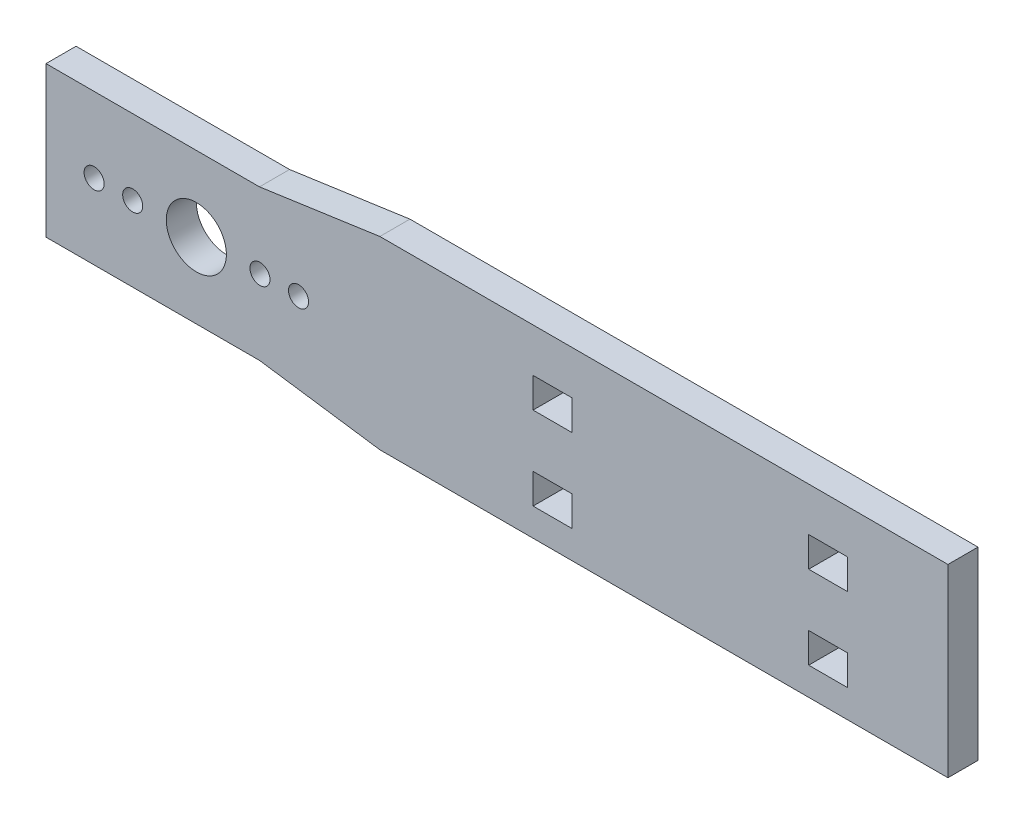
ISO-10303-21;
HEADER;
FILE_DESCRIPTION(('STEP AP214'),'2;1');
FILE_NAME('part.step','',(''),(''),'','','');
FILE_SCHEMA(('AUTOMOTIVE_DESIGN { 1 0 10303 214 1 1 1 1 }'));
ENDSEC;
DATA;
#1=APPLICATION_CONTEXT('core data for automotive mechanical design processes');
#2=APPLICATION_PROTOCOL_DEFINITION('international standard','automotive_design',2000,#1);
#3=PRODUCT_CONTEXT('',#1,'mechanical');
#4=PRODUCT('Part','Part','',(#3));
#5=PRODUCT_RELATED_PRODUCT_CATEGORY('part','',(#4));
#6=PRODUCT_DEFINITION_FORMATION('','',#4);
#7=PRODUCT_DEFINITION_CONTEXT('part definition',#1,'design');
#8=PRODUCT_DEFINITION('design','',#6,#7);
#9=PRODUCT_DEFINITION_SHAPE('','',#8);
#10=(LENGTH_UNIT() NAMED_UNIT(*) SI_UNIT(.MILLI.,.METRE.));
#11=(NAMED_UNIT(*) PLANE_ANGLE_UNIT() SI_UNIT($,.RADIAN.));
#12=(NAMED_UNIT(*) SI_UNIT($,.STERADIAN.) SOLID_ANGLE_UNIT());
#13=UNCERTAINTY_MEASURE_WITH_UNIT(LENGTH_MEASURE(1.E-05),#10,'distance_accuracy_value','');
#14=(GEOMETRIC_REPRESENTATION_CONTEXT(3) GLOBAL_UNCERTAINTY_ASSIGNED_CONTEXT((#13)) GLOBAL_UNIT_ASSIGNED_CONTEXT((#10,
#11,#12)) REPRESENTATION_CONTEXT('',''));
#15=CARTESIAN_POINT('',(0.,0.,0.));
#16=DIRECTION('',(0.,0.,1.));
#17=DIRECTION('',(1.,0.,0.));
#18=AXIS2_PLACEMENT_3D('',#15,#16,#17);
#19=CARTESIAN_POINT('',(0.,0.,3.));
#20=DIRECTION('',(0.,0.,1.));
#21=DIRECTION('',(1.,0.,0.));
#22=AXIS2_PLACEMENT_3D('',#19,#20,#21);
#23=PLANE('',#22);
#24=CARTESIAN_POINT('',(-394.38605443631,290.5765,3.));
#25=DIRECTION('',(0.,0.,1.));
#26=DIRECTION('',(1.,0.,0.));
#27=AXIS2_PLACEMENT_3D('',#24,#25,#26);
#28=CIRCLE('',#27,1.00090000000004);
#29=CARTESIAN_POINT('',(-393.38515443631,290.5765,3.));
#30=VERTEX_POINT('',#29);
#31=EDGE_CURVE('E496',#30,#30,#28,.T.);
#32=ORIENTED_EDGE('',*,*,#31,.F.);
#33=EDGE_LOOP('',(#32));
#34=FACE_BOUND('',#33,.T.);
#35=CARTESIAN_POINT('',(-398.23605443631,290.5765,3.));
#36=DIRECTION('',(0.,0.,1.));
#37=DIRECTION('',(1.,0.,0.));
#38=AXIS2_PLACEMENT_3D('',#35,#36,#37);
#39=CIRCLE('',#38,1.00090000000004);
#40=CARTESIAN_POINT('',(-397.23515443631,290.5765,3.));
#41=VERTEX_POINT('',#40);
#42=EDGE_CURVE('E490',#41,#41,#39,.T.);
#43=ORIENTED_EDGE('',*,*,#42,.F.);
#44=EDGE_LOOP('',(#43));
#45=FACE_BOUND('',#44,.T.);
#46=CARTESIAN_POINT('',(-410.93605443631,290.5765,3.));
#47=DIRECTION('',(0.,0.,1.));
#48=DIRECTION('',(1.,0.,0.));
#49=AXIS2_PLACEMENT_3D('',#46,#47,#48);
#50=CIRCLE('',#49,1.00090000000004);
#51=CARTESIAN_POINT('',(-409.93515443631,290.5765,3.));
#52=VERTEX_POINT('',#51);
#53=EDGE_CURVE('E484',#52,#52,#50,.T.);
#54=ORIENTED_EDGE('',*,*,#53,.F.);
#55=EDGE_LOOP('',(#54));
#56=FACE_BOUND('',#55,.T.);
#57=CARTESIAN_POINT('',(-414.78605443631,290.5765,3.));
#58=DIRECTION('',(0.,0.,1.));
#59=DIRECTION('',(1.,0.,0.));
#60=AXIS2_PLACEMENT_3D('',#57,#58,#59);
#61=CIRCLE('',#60,1.00090000000004);
#62=CARTESIAN_POINT('',(-413.78515443631,290.5765,3.));
#63=VERTEX_POINT('',#62);
#64=EDGE_CURVE('E478',#63,#63,#61,.T.);
#65=ORIENTED_EDGE('',*,*,#64,.F.);
#66=EDGE_LOOP('',(#65));
#67=FACE_BOUND('',#66,.T.);
#68=DIRECTION('',(1.,0.,0.));
#69=VECTOR('',#68,1.);
#70=CARTESIAN_POINT('',(-343.482562351102,284.140934884704,3.));
#71=LINE('',#70,#69);
#72=CARTESIAN_POINT('',(-343.482562351102,284.140934884704,3.));
#73=VERTEX_POINT('',#72);
#74=CARTESIAN_POINT('',(-339.602562351102,284.140934884704,3.));
#75=VERTEX_POINT('',#74);
#76=EDGE_CURVE('E202',#73,#75,#71,.T.);
#77=ORIENTED_EDGE('',*,*,#76,.F.);
#78=DIRECTION('',(0.,-1.,0.));
#79=VECTOR('',#78,1.);
#80=CARTESIAN_POINT('',(-343.482562351102,287.140934884704,3.));
#81=LINE('',#80,#79);
#82=CARTESIAN_POINT('',(-343.482562351102,287.140934884704,3.));
#83=VERTEX_POINT('',#82);
#84=EDGE_CURVE('E194',#83,#73,#81,.T.);
#85=ORIENTED_EDGE('',*,*,#84,.F.);
#86=DIRECTION('',(-1.,0.,0.));
#87=VECTOR('',#86,1.);
#88=CARTESIAN_POINT('',(-343.482562351102,287.140934884704,3.));
#89=LINE('',#88,#87);
#90=CARTESIAN_POINT('',(-339.602562351102,287.140934884704,3.));
#91=VERTEX_POINT('',#90);
#92=EDGE_CURVE('E217',#91,#83,#89,.T.);
#93=ORIENTED_EDGE('',*,*,#92,.F.);
#94=DIRECTION('',(0.,1.,0.));
#95=VECTOR('',#94,1.);
#96=CARTESIAN_POINT('',(-339.602562351102,287.140934884704,3.));
#97=LINE('',#96,#95);
#98=EDGE_CURVE('E215',#75,#91,#97,.T.);
#99=ORIENTED_EDGE('',*,*,#98,.F.);
#100=EDGE_LOOP('',(#77,#85,#93,#99));
#101=FACE_BOUND('',#100,.T.);
#102=DIRECTION('',(1.,0.,0.));
#103=VECTOR('',#102,1.);
#104=CARTESIAN_POINT('',(-370.984562351102,284.140934884704,3.));
#105=LINE('',#104,#103);
#106=CARTESIAN_POINT('',(-370.984562351102,284.140934884704,3.));
#107=VERTEX_POINT('',#106);
#108=CARTESIAN_POINT('',(-367.104562351102,284.140934884704,3.));
#109=VERTEX_POINT('',#108);
#110=EDGE_CURVE('E266',#107,#109,#105,.T.);
#111=ORIENTED_EDGE('',*,*,#110,.F.);
#112=DIRECTION('',(0.,-1.,0.));
#113=VECTOR('',#112,1.);
#114=CARTESIAN_POINT('',(-370.984562351102,287.140934884704,3.));
#115=LINE('',#114,#113);
#116=CARTESIAN_POINT('',(-370.984562351102,287.140934884704,3.));
#117=VERTEX_POINT('',#116);
#118=EDGE_CURVE('E264',#117,#107,#115,.T.);
#119=ORIENTED_EDGE('',*,*,#118,.F.);
#120=DIRECTION('',(-1.,0.,0.));
#121=VECTOR('',#120,1.);
#122=CARTESIAN_POINT('',(-370.984562351102,287.140934884704,3.));
#123=LINE('',#122,#121);
#124=CARTESIAN_POINT('',(-367.104562351102,287.140934884704,3.));
#125=VERTEX_POINT('',#124);
#126=EDGE_CURVE('E272',#125,#117,#123,.T.);
#127=ORIENTED_EDGE('',*,*,#126,.F.);
#128=DIRECTION('',(0.,1.,0.));
#129=VECTOR('',#128,1.);
#130=CARTESIAN_POINT('',(-367.104562351102,287.140934884704,3.));
#131=LINE('',#130,#129);
#132=EDGE_CURVE('E269',#109,#125,#131,.T.);
#133=ORIENTED_EDGE('',*,*,#132,.F.);
#134=EDGE_LOOP('',(#111,#119,#127,#133));
#135=FACE_BOUND('',#134,.T.);
#136=DIRECTION('',(-1.,0.,0.));
#137=VECTOR('',#136,1.);
#138=CARTESIAN_POINT('',(-398.2841,298.0765,3.));
#139=LINE('',#138,#137);
#140=CARTESIAN_POINT('',(-398.2841,298.0765,3.));
#141=VERTEX_POINT('',#140);
#142=CARTESIAN_POINT('',(-419.587365996375,298.0765,3.));
#143=VERTEX_POINT('',#142);
#144=EDGE_CURVE('E326',#141,#143,#139,.T.);
#145=ORIENTED_EDGE('',*,*,#144,.T.);
#146=DIRECTION('',(0.,-1.,0.));
#147=VECTOR('',#146,1.);
#148=CARTESIAN_POINT('',(-419.587365996375,298.0765,3.));
#149=LINE('',#148,#147);
#150=CARTESIAN_POINT('',(-419.587365996375,283.0765,3.));
#151=VERTEX_POINT('',#150);
#152=EDGE_CURVE('E329',#143,#151,#149,.T.);
#153=ORIENTED_EDGE('',*,*,#152,.T.);
#154=DIRECTION('',(1.,0.,0.));
#155=VECTOR('',#154,1.);
#156=CARTESIAN_POINT('',(-398.2841,283.0765,3.));
#157=LINE('',#156,#155);
#158=CARTESIAN_POINT('',(-398.2841,283.0765,3.));
#159=VERTEX_POINT('',#158);
#160=EDGE_CURVE('E332',#151,#159,#157,.T.);
#161=ORIENTED_EDGE('',*,*,#160,.T.);
#162=DIRECTION('',(0.98993057725089,-0.141553707912296,0.));
#163=VECTOR('',#162,1.);
#164=CARTESIAN_POINT('',(-386.271234014353,281.358737399269,3.));
#165=LINE('',#164,#163);
#166=CARTESIAN_POINT('',(-386.271234014353,281.358737399269,3.));
#167=VERTEX_POINT('',#166);
#168=EDGE_CURVE('E334',#159,#167,#165,.T.);
#169=ORIENTED_EDGE('',*,*,#168,.T.);
#170=DIRECTION('',(1.,0.,0.));
#171=VECTOR('',#170,1.);
#172=CARTESIAN_POINT('',(-329.587365996375,281.358737399269,3.));
#173=LINE('',#172,#171);
#174=CARTESIAN_POINT('',(-329.587365996375,281.358737399269,3.));
#175=VERTEX_POINT('',#174);
#176=EDGE_CURVE('E336',#167,#175,#173,.T.);
#177=ORIENTED_EDGE('',*,*,#176,.T.);
#178=DIRECTION('',(0.,1.,0.));
#179=VECTOR('',#178,1.);
#180=CARTESIAN_POINT('',(-329.587365996375,299.794262600731,3.));
#181=LINE('',#180,#179);
#182=CARTESIAN_POINT('',(-329.587365996375,299.794262600731,3.));
#183=VERTEX_POINT('',#182);
#184=EDGE_CURVE('E338',#175,#183,#181,.T.);
#185=ORIENTED_EDGE('',*,*,#184,.T.);
#186=DIRECTION('',(-1.,0.,0.));
#187=VECTOR('',#186,1.);
#188=CARTESIAN_POINT('',(-386.271234014353,299.794262600731,3.));
#189=LINE('',#188,#187);
#190=CARTESIAN_POINT('',(-386.271234014353,299.794262600731,3.));
#191=VERTEX_POINT('',#190);
#192=EDGE_CURVE('E340',#183,#191,#189,.T.);
#193=ORIENTED_EDGE('',*,*,#192,.T.);
#194=DIRECTION('',(-0.98993057725089,-0.141553707912296,0.));
#195=VECTOR('',#194,1.);
#196=CARTESIAN_POINT('',(-398.2841,298.0765,3.));
#197=LINE('',#196,#195);
#198=EDGE_CURVE('E342',#191,#141,#197,.T.);
#199=ORIENTED_EDGE('',*,*,#198,.T.);
#200=EDGE_LOOP('',(#145,#153,#161,#169,#177,#185,#193,#199));
#201=FACE_BOUND('',#200,.T.);
#202=DIRECTION('',(1.,0.,0.));
#203=VECTOR('',#202,1.);
#204=CARTESIAN_POINT('',(-370.984562351102,292.435134884704,3.));
#205=LINE('',#204,#203);
#206=CARTESIAN_POINT('',(-370.984562351102,292.435134884704,3.));
#207=VERTEX_POINT('',#206);
#208=CARTESIAN_POINT('',(-367.104562351102,292.435134884704,3.));
#209=VERTEX_POINT('',#208);
#210=EDGE_CURVE('E297',#207,#209,#205,.T.);
#211=ORIENTED_EDGE('',*,*,#210,.F.);
#212=DIRECTION('',(0.,-1.,0.));
#213=VECTOR('',#212,1.);
#214=CARTESIAN_POINT('',(-370.984562351102,295.435134884704,3.));
#215=LINE('',#214,#213);
#216=CARTESIAN_POINT('',(-370.984562351102,295.435134884704,3.));
#217=VERTEX_POINT('',#216);
#218=EDGE_CURVE('E295',#217,#207,#215,.T.);
#219=ORIENTED_EDGE('',*,*,#218,.F.);
#220=DIRECTION('',(-1.,0.,0.));
#221=VECTOR('',#220,1.);
#222=CARTESIAN_POINT('',(-370.984562351102,295.435134884704,3.));
#223=LINE('',#222,#221);
#224=CARTESIAN_POINT('',(-367.104562351102,295.435134884704,3.));
#225=VERTEX_POINT('',#224);
#226=EDGE_CURVE('E303',#225,#217,#223,.T.);
#227=ORIENTED_EDGE('',*,*,#226,.F.);
#228=DIRECTION('',(0.,1.,0.));
#229=VECTOR('',#228,1.);
#230=CARTESIAN_POINT('',(-367.104562351102,295.435134884704,3.));
#231=LINE('',#230,#229);
#232=EDGE_CURVE('E300',#209,#225,#231,.T.);
#233=ORIENTED_EDGE('',*,*,#232,.F.);
#234=EDGE_LOOP('',(#211,#219,#227,#233));
#235=FACE_BOUND('',#234,.T.);
#236=DIRECTION('',(1.,0.,0.));
#237=VECTOR('',#236,1.);
#238=CARTESIAN_POINT('',(-343.482562351102,292.435134884704,3.));
#239=LINE('',#238,#237);
#240=CARTESIAN_POINT('',(-343.482562351102,292.435134884704,3.));
#241=VERTEX_POINT('',#240);
#242=CARTESIAN_POINT('',(-339.602562351102,292.435134884704,3.));
#243=VERTEX_POINT('',#242);
#244=EDGE_CURVE('E235',#241,#243,#239,.T.);
#245=ORIENTED_EDGE('',*,*,#244,.F.);
#246=DIRECTION('',(0.,-1.,0.));
#247=VECTOR('',#246,1.);
#248=CARTESIAN_POINT('',(-343.482562351102,295.435134884704,3.));
#249=LINE('',#248,#247);
#250=CARTESIAN_POINT('',(-343.482562351102,295.435134884704,3.));
#251=VERTEX_POINT('',#250);
#252=EDGE_CURVE('E233',#251,#241,#249,.T.);
#253=ORIENTED_EDGE('',*,*,#252,.F.);
#254=DIRECTION('',(-1.,0.,0.));
#255=VECTOR('',#254,1.);
#256=CARTESIAN_POINT('',(-343.482562351102,295.435134884704,3.));
#257=LINE('',#256,#255);
#258=CARTESIAN_POINT('',(-339.602562351102,295.435134884704,3.));
#259=VERTEX_POINT('',#258);
#260=EDGE_CURVE('E241',#259,#251,#257,.T.);
#261=ORIENTED_EDGE('',*,*,#260,.F.);
#262=DIRECTION('',(0.,1.,0.));
#263=VECTOR('',#262,1.);
#264=CARTESIAN_POINT('',(-339.602562351102,295.435134884704,3.));
#265=LINE('',#264,#263);
#266=EDGE_CURVE('E238',#243,#259,#265,.T.);
#267=ORIENTED_EDGE('',*,*,#266,.F.);
#268=EDGE_LOOP('',(#245,#253,#261,#267));
#269=FACE_BOUND('',#268,.T.);
#270=CARTESIAN_POINT('',(-404.58605443631,290.5765,3.));
#271=DIRECTION('',(0.,0.,1.));
#272=DIRECTION('',(1.,0.,0.));
#273=AXIS2_PLACEMENT_3D('',#270,#271,#272);
#274=CIRCLE('',#273,2.99999999999999);
#275=CARTESIAN_POINT('',(-401.58605443631,290.5765,3.));
#276=VERTEX_POINT('',#275);
#277=EDGE_CURVE('E223',#276,#276,#274,.T.);
#278=ORIENTED_EDGE('',*,*,#277,.F.);
#279=EDGE_LOOP('',(#278));
#280=FACE_BOUND('',#279,.T.);
#281=ADVANCED_FACE('F33',(#34,#45,#56,#67,#101,#135,#201,#235,#269,#280),#23,.T.);
#282=CARTESIAN_POINT('',(0.,0.,0.));
#283=DIRECTION('',(0.,0.,1.));
#284=DIRECTION('',(1.,0.,0.));
#285=AXIS2_PLACEMENT_3D('',#282,#283,#284);
#286=PLANE('',#285);
#287=CARTESIAN_POINT('',(-394.38605443631,290.5765,0.));
#288=DIRECTION('',(0.,0.,1.));
#289=DIRECTION('',(1.,0.,0.));
#290=AXIS2_PLACEMENT_3D('',#287,#288,#289);
#291=CIRCLE('',#290,1.00090000000004);
#292=CARTESIAN_POINT('',(-393.38515443631,290.5765,0.));
#293=VERTEX_POINT('',#292);
#294=EDGE_CURVE('E493',#293,#293,#291,.T.);
#295=ORIENTED_EDGE('',*,*,#294,.T.);
#296=EDGE_LOOP('',(#295));
#297=FACE_BOUND('',#296,.T.);
#298=CARTESIAN_POINT('',(-398.23605443631,290.5765,0.));
#299=DIRECTION('',(0.,0.,1.));
#300=DIRECTION('',(1.,0.,0.));
#301=AXIS2_PLACEMENT_3D('',#298,#299,#300);
#302=CIRCLE('',#301,1.00090000000004);
#303=CARTESIAN_POINT('',(-397.23515443631,290.5765,0.));
#304=VERTEX_POINT('',#303);
#305=EDGE_CURVE('E487',#304,#304,#302,.T.);
#306=ORIENTED_EDGE('',*,*,#305,.T.);
#307=EDGE_LOOP('',(#306));
#308=FACE_BOUND('',#307,.T.);
#309=CARTESIAN_POINT('',(-410.93605443631,290.5765,0.));
#310=DIRECTION('',(0.,0.,1.));
#311=DIRECTION('',(1.,0.,0.));
#312=AXIS2_PLACEMENT_3D('',#309,#310,#311);
#313=CIRCLE('',#312,1.00090000000004);
#314=CARTESIAN_POINT('',(-409.93515443631,290.5765,0.));
#315=VERTEX_POINT('',#314);
#316=EDGE_CURVE('E481',#315,#315,#313,.T.);
#317=ORIENTED_EDGE('',*,*,#316,.T.);
#318=EDGE_LOOP('',(#317));
#319=FACE_BOUND('',#318,.T.);
#320=CARTESIAN_POINT('',(-414.78605443631,290.5765,0.));
#321=DIRECTION('',(0.,0.,1.));
#322=DIRECTION('',(1.,0.,0.));
#323=AXIS2_PLACEMENT_3D('',#320,#321,#322);
#324=CIRCLE('',#323,1.00090000000004);
#325=CARTESIAN_POINT('',(-413.78515443631,290.5765,0.));
#326=VERTEX_POINT('',#325);
#327=EDGE_CURVE('E476',#326,#326,#324,.T.);
#328=ORIENTED_EDGE('',*,*,#327,.T.);
#329=EDGE_LOOP('',(#328));
#330=FACE_BOUND('',#329,.T.);
#331=DIRECTION('',(0.,-1.,0.));
#332=VECTOR('',#331,1.);
#333=CARTESIAN_POINT('',(-343.482562351102,287.140934884704,0.));
#334=LINE('',#333,#332);
#335=CARTESIAN_POINT('',(-343.482562351102,287.140934884704,0.));
#336=VERTEX_POINT('',#335);
#337=CARTESIAN_POINT('',(-343.482562351102,284.140934884704,0.));
#338=VERTEX_POINT('',#337);
#339=EDGE_CURVE('E56',#336,#338,#334,.T.);
#340=ORIENTED_EDGE('',*,*,#339,.T.);
#341=DIRECTION('',(1.,0.,0.));
#342=VECTOR('',#341,1.);
#343=CARTESIAN_POINT('',(-343.482562351102,284.140934884704,0.));
#344=LINE('',#343,#342);
#345=CARTESIAN_POINT('',(-339.602562351102,284.140934884704,0.));
#346=VERTEX_POINT('',#345);
#347=EDGE_CURVE('E209',#338,#346,#344,.T.);
#348=ORIENTED_EDGE('',*,*,#347,.T.);
#349=DIRECTION('',(0.,1.,0.));
#350=VECTOR('',#349,1.);
#351=CARTESIAN_POINT('',(-339.602562351102,287.140934884704,0.));
#352=LINE('',#351,#350);
#353=CARTESIAN_POINT('',(-339.602562351102,287.140934884704,0.));
#354=VERTEX_POINT('',#353);
#355=EDGE_CURVE('E225',#346,#354,#352,.T.);
#356=ORIENTED_EDGE('',*,*,#355,.T.);
#357=DIRECTION('',(-1.,0.,0.));
#358=VECTOR('',#357,1.);
#359=CARTESIAN_POINT('',(-343.482562351102,287.140934884704,0.));
#360=LINE('',#359,#358);
#361=EDGE_CURVE('E203',#354,#336,#360,.T.);
#362=ORIENTED_EDGE('',*,*,#361,.T.);
#363=EDGE_LOOP('',(#340,#348,#356,#362));
#364=FACE_BOUND('',#363,.T.);
#365=DIRECTION('',(0.,-1.,0.));
#366=VECTOR('',#365,1.);
#367=CARTESIAN_POINT('',(-370.984562351102,287.140934884704,0.));
#368=LINE('',#367,#366);
#369=CARTESIAN_POINT('',(-370.984562351102,287.140934884704,0.));
#370=VERTEX_POINT('',#369);
#371=CARTESIAN_POINT('',(-370.984562351102,284.140934884704,0.));
#372=VERTEX_POINT('',#371);
#373=EDGE_CURVE('E263',#370,#372,#368,.T.);
#374=ORIENTED_EDGE('',*,*,#373,.T.);
#375=DIRECTION('',(1.,0.,0.));
#376=VECTOR('',#375,1.);
#377=CARTESIAN_POINT('',(-370.984562351102,284.140934884704,0.));
#378=LINE('',#377,#376);
#379=CARTESIAN_POINT('',(-367.104562351102,284.140934884704,0.));
#380=VERTEX_POINT('',#379);
#381=EDGE_CURVE('E277',#372,#380,#378,.T.);
#382=ORIENTED_EDGE('',*,*,#381,.T.);
#383=DIRECTION('',(0.,1.,0.));
#384=VECTOR('',#383,1.);
#385=CARTESIAN_POINT('',(-367.104562351102,287.140934884704,0.));
#386=LINE('',#385,#384);
#387=CARTESIAN_POINT('',(-367.104562351102,287.140934884704,0.));
#388=VERTEX_POINT('',#387);
#389=EDGE_CURVE('E280',#380,#388,#386,.T.);
#390=ORIENTED_EDGE('',*,*,#389,.T.);
#391=DIRECTION('',(-1.,0.,0.));
#392=VECTOR('',#391,1.);
#393=CARTESIAN_POINT('',(-370.984562351102,287.140934884704,0.));
#394=LINE('',#393,#392);
#395=EDGE_CURVE('E267',#388,#370,#394,.T.);
#396=ORIENTED_EDGE('',*,*,#395,.T.);
#397=EDGE_LOOP('',(#374,#382,#390,#396));
#398=FACE_BOUND('',#397,.T.);
#399=DIRECTION('',(-1.,0.,0.));
#400=VECTOR('',#399,1.);
#401=CARTESIAN_POINT('',(-398.2841,298.0765,0.));
#402=LINE('',#401,#400);
#403=CARTESIAN_POINT('',(-398.2841,298.0765,0.));
#404=VERTEX_POINT('',#403);
#405=CARTESIAN_POINT('',(-419.587365996375,298.0765,0.));
#406=VERTEX_POINT('',#405);
#407=EDGE_CURVE('E325',#404,#406,#402,.T.);
#408=ORIENTED_EDGE('',*,*,#407,.F.);
#409=DIRECTION('',(-0.98993057725089,-0.141553707912296,0.));
#410=VECTOR('',#409,1.);
#411=CARTESIAN_POINT('',(-398.2841,298.0765,0.));
#412=LINE('',#411,#410);
#413=CARTESIAN_POINT('',(-386.271234014353,299.794262600731,0.));
#414=VERTEX_POINT('',#413);
#415=EDGE_CURVE('E330',#414,#404,#412,.T.);
#416=ORIENTED_EDGE('',*,*,#415,.F.);
#417=DIRECTION('',(-1.,0.,0.));
#418=VECTOR('',#417,1.);
#419=CARTESIAN_POINT('',(-386.271234014353,299.794262600731,0.));
#420=LINE('',#419,#418);
#421=CARTESIAN_POINT('',(-329.587365996375,299.794262600731,0.));
#422=VERTEX_POINT('',#421);
#423=EDGE_CURVE('E357',#422,#414,#420,.T.);
#424=ORIENTED_EDGE('',*,*,#423,.F.);
#425=DIRECTION('',(0.,1.,0.));
#426=VECTOR('',#425,1.);
#427=CARTESIAN_POINT('',(-329.587365996375,299.794262600731,0.));
#428=LINE('',#427,#426);
#429=CARTESIAN_POINT('',(-329.587365996375,281.358737399269,0.));
#430=VERTEX_POINT('',#429);
#431=EDGE_CURVE('E355',#430,#422,#428,.T.);
#432=ORIENTED_EDGE('',*,*,#431,.F.);
#433=DIRECTION('',(1.,0.,0.));
#434=VECTOR('',#433,1.);
#435=CARTESIAN_POINT('',(-329.587365996375,281.358737399269,0.));
#436=LINE('',#435,#434);
#437=CARTESIAN_POINT('',(-386.271234014353,281.358737399269,0.));
#438=VERTEX_POINT('',#437);
#439=EDGE_CURVE('E353',#438,#430,#436,.T.);
#440=ORIENTED_EDGE('',*,*,#439,.F.);
#441=DIRECTION('',(0.98993057725089,-0.141553707912296,0.));
#442=VECTOR('',#441,1.);
#443=CARTESIAN_POINT('',(-386.271234014353,281.358737399269,0.));
#444=LINE('',#443,#442);
#445=CARTESIAN_POINT('',(-398.2841,283.0765,0.));
#446=VERTEX_POINT('',#445);
#447=EDGE_CURVE('E351',#446,#438,#444,.T.);
#448=ORIENTED_EDGE('',*,*,#447,.F.);
#449=DIRECTION('',(1.,0.,0.));
#450=VECTOR('',#449,1.);
#451=CARTESIAN_POINT('',(-398.2841,283.0765,0.));
#452=LINE('',#451,#450);
#453=CARTESIAN_POINT('',(-419.587365996375,283.0765,0.));
#454=VERTEX_POINT('',#453);
#455=EDGE_CURVE('E349',#454,#446,#452,.T.);
#456=ORIENTED_EDGE('',*,*,#455,.F.);
#457=DIRECTION('',(0.,-1.,0.));
#458=VECTOR('',#457,1.);
#459=CARTESIAN_POINT('',(-419.587365996375,298.0765,0.));
#460=LINE('',#459,#458);
#461=EDGE_CURVE('E347',#406,#454,#460,.T.);
#462=ORIENTED_EDGE('',*,*,#461,.F.);
#463=EDGE_LOOP('',(#408,#416,#424,#432,#440,#448,#456,#462));
#464=FACE_BOUND('',#463,.T.);
#465=DIRECTION('',(0.,-1.,0.));
#466=VECTOR('',#465,1.);
#467=CARTESIAN_POINT('',(-370.984562351102,295.435134884704,0.));
#468=LINE('',#467,#466);
#469=CARTESIAN_POINT('',(-370.984562351102,295.435134884704,0.));
#470=VERTEX_POINT('',#469);
#471=CARTESIAN_POINT('',(-370.984562351102,292.435134884704,0.));
#472=VERTEX_POINT('',#471);
#473=EDGE_CURVE('E294',#470,#472,#468,.T.);
#474=ORIENTED_EDGE('',*,*,#473,.T.);
#475=DIRECTION('',(1.,0.,0.));
#476=VECTOR('',#475,1.);
#477=CARTESIAN_POINT('',(-370.984562351102,292.435134884704,0.));
#478=LINE('',#477,#476);
#479=CARTESIAN_POINT('',(-367.104562351102,292.435134884704,0.));
#480=VERTEX_POINT('',#479);
#481=EDGE_CURVE('E308',#472,#480,#478,.T.);
#482=ORIENTED_EDGE('',*,*,#481,.T.);
#483=DIRECTION('',(0.,1.,0.));
#484=VECTOR('',#483,1.);
#485=CARTESIAN_POINT('',(-367.104562351102,295.435134884704,0.));
#486=LINE('',#485,#484);
#487=CARTESIAN_POINT('',(-367.104562351102,295.435134884704,0.));
#488=VERTEX_POINT('',#487);
#489=EDGE_CURVE('E311',#480,#488,#486,.T.);
#490=ORIENTED_EDGE('',*,*,#489,.T.);
#491=DIRECTION('',(-1.,0.,0.));
#492=VECTOR('',#491,1.);
#493=CARTESIAN_POINT('',(-370.984562351102,295.435134884704,0.));
#494=LINE('',#493,#492);
#495=EDGE_CURVE('E298',#488,#470,#494,.T.);
#496=ORIENTED_EDGE('',*,*,#495,.T.);
#497=EDGE_LOOP('',(#474,#482,#490,#496));
#498=FACE_BOUND('',#497,.T.);
#499=DIRECTION('',(0.,-1.,0.));
#500=VECTOR('',#499,1.);
#501=CARTESIAN_POINT('',(-343.482562351102,295.435134884704,0.));
#502=LINE('',#501,#500);
#503=CARTESIAN_POINT('',(-343.482562351102,295.435134884704,0.));
#504=VERTEX_POINT('',#503);
#505=CARTESIAN_POINT('',(-343.482562351102,292.435134884704,0.));
#506=VERTEX_POINT('',#505);
#507=EDGE_CURVE('E210',#504,#506,#502,.T.);
#508=ORIENTED_EDGE('',*,*,#507,.T.);
#509=DIRECTION('',(1.,0.,0.));
#510=VECTOR('',#509,1.);
#511=CARTESIAN_POINT('',(-343.482562351102,292.435134884704,0.));
#512=LINE('',#511,#510);
#513=CARTESIAN_POINT('',(-339.602562351102,292.435134884704,0.));
#514=VERTEX_POINT('',#513);
#515=EDGE_CURVE('E246',#506,#514,#512,.T.);
#516=ORIENTED_EDGE('',*,*,#515,.T.);
#517=DIRECTION('',(0.,1.,0.));
#518=VECTOR('',#517,1.);
#519=CARTESIAN_POINT('',(-339.602562351102,295.435134884704,0.));
#520=LINE('',#519,#518);
#521=CARTESIAN_POINT('',(-339.602562351102,295.435134884704,0.));
#522=VERTEX_POINT('',#521);
#523=EDGE_CURVE('E249',#514,#522,#520,.T.);
#524=ORIENTED_EDGE('',*,*,#523,.T.);
#525=DIRECTION('',(-1.,0.,0.));
#526=VECTOR('',#525,1.);
#527=CARTESIAN_POINT('',(-343.482562351102,295.435134884704,0.));
#528=LINE('',#527,#526);
#529=EDGE_CURVE('E236',#522,#504,#528,.T.);
#530=ORIENTED_EDGE('',*,*,#529,.T.);
#531=EDGE_LOOP('',(#508,#516,#524,#530));
#532=FACE_BOUND('',#531,.T.);
#533=CARTESIAN_POINT('',(-404.58605443631,290.5765,0.));
#534=DIRECTION('',(0.,0.,1.));
#535=DIRECTION('',(1.,0.,0.));
#536=AXIS2_PLACEMENT_3D('',#533,#534,#535);
#537=CIRCLE('',#536,2.99999999999999);
#538=CARTESIAN_POINT('',(-401.58605443631,290.5765,0.));
#539=VERTEX_POINT('',#538);
#540=EDGE_CURVE('E473',#539,#539,#537,.T.);
#541=ORIENTED_EDGE('',*,*,#540,.T.);
#542=EDGE_LOOP('',(#541));
#543=FACE_BOUND('',#542,.T.);
#544=ADVANCED_FACE('F387',(#297,#308,#319,#330,#364,#398,#464,#498,#532,#543),#286,.F.);
#545=CARTESIAN_POINT('',(-398.2841,298.0765,3.));
#546=DIRECTION('',(0.,-1.,0.));
#547=DIRECTION('',(0.,0.,-1.));
#548=AXIS2_PLACEMENT_3D('',#545,#546,#547);
#549=PLANE('',#548);
#550=ORIENTED_EDGE('',*,*,#407,.T.);
#551=DIRECTION('',(0.,0.,-1.));
#552=VECTOR('',#551,1.);
#553=CARTESIAN_POINT('',(-419.587365996375,298.0765,3.));
#554=LINE('',#553,#552);
#555=EDGE_CURVE('E11',#143,#406,#554,.T.);
#556=ORIENTED_EDGE('',*,*,#555,.F.);
#557=ORIENTED_EDGE('',*,*,#144,.F.);
#558=DIRECTION('',(0.,0.,-1.));
#559=VECTOR('',#558,1.);
#560=CARTESIAN_POINT('',(-398.2841,298.0765,3.));
#561=LINE('',#560,#559);
#562=EDGE_CURVE('E344',#141,#404,#561,.T.);
#563=ORIENTED_EDGE('',*,*,#562,.T.);
#564=EDGE_LOOP('',(#550,#556,#557,#563));
#565=FACE_BOUND('',#564,.T.);
#566=ADVANCED_FACE('F35',(#565),#549,.F.);
#567=CARTESIAN_POINT('',(-419.587365996375,298.0765,3.));
#568=DIRECTION('',(1.,0.,0.));
#569=DIRECTION('',(0.,1.,0.));
#570=AXIS2_PLACEMENT_3D('',#567,#568,#569);
#571=PLANE('',#570);
#572=ORIENTED_EDGE('',*,*,#461,.T.);
#573=DIRECTION('',(0.,0.,-1.));
#574=VECTOR('',#573,1.);
#575=CARTESIAN_POINT('',(-419.587365996375,283.0765,3.));
#576=LINE('',#575,#574);
#577=EDGE_CURVE('E41',#151,#454,#576,.T.);
#578=ORIENTED_EDGE('',*,*,#577,.F.);
#579=ORIENTED_EDGE('',*,*,#152,.F.);
#580=ORIENTED_EDGE('',*,*,#555,.T.);
#581=EDGE_LOOP('',(#572,#578,#579,#580));
#582=FACE_BOUND('',#581,.T.);
#583=ADVANCED_FACE('F405',(#582),#571,.F.);
#584=CARTESIAN_POINT('',(-398.2841,283.0765,3.));
#585=DIRECTION('',(0.,1.,0.));
#586=DIRECTION('',(0.,0.,1.));
#587=AXIS2_PLACEMENT_3D('',#584,#585,#586);
#588=PLANE('',#587);
#589=ORIENTED_EDGE('',*,*,#455,.T.);
#590=DIRECTION('',(0.,0.,-1.));
#591=VECTOR('',#590,1.);
#592=CARTESIAN_POINT('',(-398.2841,283.0765,3.));
#593=LINE('',#592,#591);
#594=EDGE_CURVE('E374',#159,#446,#593,.T.);
#595=ORIENTED_EDGE('',*,*,#594,.F.);
#596=ORIENTED_EDGE('',*,*,#160,.F.);
#597=ORIENTED_EDGE('',*,*,#577,.T.);
#598=EDGE_LOOP('',(#589,#595,#596,#597));
#599=FACE_BOUND('',#598,.T.);
#600=ADVANCED_FACE('F381',(#599),#588,.F.);
#601=CARTESIAN_POINT('',(-386.271234014353,281.358737399269,3.));
#602=DIRECTION('',(0.141553707912296,0.98993057725089,0.));
#603=DIRECTION('',(-0.98993057725089,0.141553707912296,0.));
#604=AXIS2_PLACEMENT_3D('',#601,#602,#603);
#605=PLANE('',#604);
#606=ORIENTED_EDGE('',*,*,#447,.T.);
#607=DIRECTION('',(0.,0.,-1.));
#608=VECTOR('',#607,1.);
#609=CARTESIAN_POINT('',(-386.271234014353,281.358737399269,3.));
#610=LINE('',#609,#608);
#611=EDGE_CURVE('E371',#167,#438,#610,.T.);
#612=ORIENTED_EDGE('',*,*,#611,.F.);
#613=ORIENTED_EDGE('',*,*,#168,.F.);
#614=ORIENTED_EDGE('',*,*,#594,.T.);
#615=EDGE_LOOP('',(#606,#612,#613,#614));
#616=FACE_BOUND('',#615,.T.);
#617=ADVANCED_FACE('F393',(#616),#605,.F.);
#618=CARTESIAN_POINT('',(-329.587365996375,281.358737399269,3.));
#619=DIRECTION('',(0.,1.,0.));
#620=DIRECTION('',(0.,0.,1.));
#621=AXIS2_PLACEMENT_3D('',#618,#619,#620);
#622=PLANE('',#621);
#623=ORIENTED_EDGE('',*,*,#439,.T.);
#624=DIRECTION('',(0.,0.,-1.));
#625=VECTOR('',#624,1.);
#626=CARTESIAN_POINT('',(-329.587365996375,281.358737399269,3.));
#627=LINE('',#626,#625);
#628=EDGE_CURVE('E368',#175,#430,#627,.T.);
#629=ORIENTED_EDGE('',*,*,#628,.F.);
#630=ORIENTED_EDGE('',*,*,#176,.F.);
#631=ORIENTED_EDGE('',*,*,#611,.T.);
#632=EDGE_LOOP('',(#623,#629,#630,#631));
#633=FACE_BOUND('',#632,.T.);
#634=ADVANCED_FACE('F397',(#633),#622,.F.);
#635=CARTESIAN_POINT('',(-329.587365996375,299.794262600731,3.));
#636=DIRECTION('',(-1.,0.,0.));
#637=DIRECTION('',(0.,0.,1.));
#638=AXIS2_PLACEMENT_3D('',#635,#636,#637);
#639=PLANE('',#638);
#640=ORIENTED_EDGE('',*,*,#431,.T.);
#641=DIRECTION('',(0.,0.,-1.));
#642=VECTOR('',#641,1.);
#643=CARTESIAN_POINT('',(-329.587365996375,299.794262600731,3.));
#644=LINE('',#643,#642);
#645=EDGE_CURVE('E365',#183,#422,#644,.T.);
#646=ORIENTED_EDGE('',*,*,#645,.F.);
#647=ORIENTED_EDGE('',*,*,#184,.F.);
#648=ORIENTED_EDGE('',*,*,#628,.T.);
#649=EDGE_LOOP('',(#640,#646,#647,#648));
#650=FACE_BOUND('',#649,.T.);
#651=ADVANCED_FACE('F418',(#650),#639,.F.);
#652=CARTESIAN_POINT('',(-386.271234014353,299.794262600731,3.));
#653=DIRECTION('',(0.,-1.,0.));
#654=DIRECTION('',(0.,0.,-1.));
#655=AXIS2_PLACEMENT_3D('',#652,#653,#654);
#656=PLANE('',#655);
#657=ORIENTED_EDGE('',*,*,#423,.T.);
#658=DIRECTION('',(0.,0.,-1.));
#659=VECTOR('',#658,1.);
#660=CARTESIAN_POINT('',(-386.271234014353,299.794262600731,3.));
#661=LINE('',#660,#659);
#662=EDGE_CURVE('E362',#191,#414,#661,.T.);
#663=ORIENTED_EDGE('',*,*,#662,.F.);
#664=ORIENTED_EDGE('',*,*,#192,.F.);
#665=ORIENTED_EDGE('',*,*,#645,.T.);
#666=EDGE_LOOP('',(#657,#663,#664,#665));
#667=FACE_BOUND('',#666,.T.);
#668=ADVANCED_FACE('F416',(#667),#656,.F.);
#669=CARTESIAN_POINT('',(-398.2841,298.0765,3.));
#670=DIRECTION('',(0.141553707912296,-0.98993057725089,0.));
#671=DIRECTION('',(0.98993057725089,0.141553707912296,0.));
#672=AXIS2_PLACEMENT_3D('',#669,#670,#671);
#673=PLANE('',#672);
#674=ORIENTED_EDGE('',*,*,#415,.T.);
#675=ORIENTED_EDGE('',*,*,#562,.F.);
#676=ORIENTED_EDGE('',*,*,#198,.F.);
#677=ORIENTED_EDGE('',*,*,#662,.T.);
#678=EDGE_LOOP('',(#674,#675,#676,#677));
#679=FACE_BOUND('',#678,.T.);
#680=ADVANCED_FACE('F411',(#679),#673,.F.);
#681=CARTESIAN_POINT('',(-370.984562351102,295.435134884704,3.));
#682=DIRECTION('',(1.,0.,0.));
#683=DIRECTION('',(0.,0.,-1.));
#684=AXIS2_PLACEMENT_3D('',#681,#682,#683);
#685=PLANE('',#684);
#686=ORIENTED_EDGE('',*,*,#473,.F.);
#687=DIRECTION('',(0.,0.,-1.));
#688=VECTOR('',#687,1.);
#689=CARTESIAN_POINT('',(-370.984562351102,295.435134884704,3.));
#690=LINE('',#689,#688);
#691=EDGE_CURVE('E305',#217,#470,#690,.T.);
#692=ORIENTED_EDGE('',*,*,#691,.F.);
#693=ORIENTED_EDGE('',*,*,#218,.T.);
#694=DIRECTION('',(0.,0.,-1.));
#695=VECTOR('',#694,1.);
#696=CARTESIAN_POINT('',(-370.984562351102,292.435134884704,3.));
#697=LINE('',#696,#695);
#698=EDGE_CURVE('E322',#207,#472,#697,.T.);
#699=ORIENTED_EDGE('',*,*,#698,.T.);
#700=EDGE_LOOP('',(#686,#692,#693,#699));
#701=FACE_BOUND('',#700,.T.);
#702=ADVANCED_FACE('F438',(#701),#685,.T.);
#703=CARTESIAN_POINT('',(-370.984562351102,292.435134884704,3.));
#704=DIRECTION('',(0.,1.,0.));
#705=DIRECTION('',(0.,0.,1.));
#706=AXIS2_PLACEMENT_3D('',#703,#704,#705);
#707=PLANE('',#706);
#708=ORIENTED_EDGE('',*,*,#481,.F.);
#709=ORIENTED_EDGE('',*,*,#698,.F.);
#710=ORIENTED_EDGE('',*,*,#210,.T.);
#711=DIRECTION('',(0.,0.,-1.));
#712=VECTOR('',#711,1.);
#713=CARTESIAN_POINT('',(-367.104562351102,292.435134884704,3.));
#714=LINE('',#713,#712);
#715=EDGE_CURVE('E320',#209,#480,#714,.T.);
#716=ORIENTED_EDGE('',*,*,#715,.T.);
#717=EDGE_LOOP('',(#708,#709,#710,#716));
#718=FACE_BOUND('',#717,.T.);
#719=ADVANCED_FACE('F445',(#718),#707,.T.);
#720=CARTESIAN_POINT('',(-367.104562351102,295.435134884704,3.));
#721=DIRECTION('',(-1.,0.,0.));
#722=DIRECTION('',(0.,0.,1.));
#723=AXIS2_PLACEMENT_3D('',#720,#721,#722);
#724=PLANE('',#723);
#725=ORIENTED_EDGE('',*,*,#489,.F.);
#726=ORIENTED_EDGE('',*,*,#715,.F.);
#727=ORIENTED_EDGE('',*,*,#232,.T.);
#728=DIRECTION('',(0.,0.,-1.));
#729=VECTOR('',#728,1.);
#730=CARTESIAN_POINT('',(-367.104562351102,295.435134884704,3.));
#731=LINE('',#730,#729);
#732=EDGE_CURVE('E318',#225,#488,#731,.T.);
#733=ORIENTED_EDGE('',*,*,#732,.T.);
#734=EDGE_LOOP('',(#725,#726,#727,#733));
#735=FACE_BOUND('',#734,.T.);
#736=ADVANCED_FACE('F450',(#735),#724,.T.);
#737=CARTESIAN_POINT('',(-370.984562351102,295.435134884704,3.));
#738=DIRECTION('',(0.,-1.,0.));
#739=DIRECTION('',(0.,0.,-1.));
#740=AXIS2_PLACEMENT_3D('',#737,#738,#739);
#741=PLANE('',#740);
#742=ORIENTED_EDGE('',*,*,#495,.F.);
#743=ORIENTED_EDGE('',*,*,#732,.F.);
#744=ORIENTED_EDGE('',*,*,#226,.T.);
#745=ORIENTED_EDGE('',*,*,#691,.T.);
#746=EDGE_LOOP('',(#742,#743,#744,#745));
#747=FACE_BOUND('',#746,.T.);
#748=ADVANCED_FACE('F457',(#747),#741,.T.);
#749=CARTESIAN_POINT('',(-370.984562351102,287.140934884704,3.));
#750=DIRECTION('',(1.,0.,0.));
#751=DIRECTION('',(0.,1.,0.));
#752=AXIS2_PLACEMENT_3D('',#749,#750,#751);
#753=PLANE('',#752);
#754=ORIENTED_EDGE('',*,*,#373,.F.);
#755=DIRECTION('',(0.,0.,-1.));
#756=VECTOR('',#755,1.);
#757=CARTESIAN_POINT('',(-370.984562351102,287.140934884704,3.));
#758=LINE('',#757,#756);
#759=EDGE_CURVE('E274',#117,#370,#758,.T.);
#760=ORIENTED_EDGE('',*,*,#759,.F.);
#761=ORIENTED_EDGE('',*,*,#118,.T.);
#762=DIRECTION('',(0.,0.,-1.));
#763=VECTOR('',#762,1.);
#764=CARTESIAN_POINT('',(-370.984562351102,284.140934884704,3.));
#765=LINE('',#764,#763);
#766=EDGE_CURVE('E291',#107,#372,#765,.T.);
#767=ORIENTED_EDGE('',*,*,#766,.T.);
#768=EDGE_LOOP('',(#754,#760,#761,#767));
#769=FACE_BOUND('',#768,.T.);
#770=ADVANCED_FACE('F563',(#769),#753,.T.);
#771=CARTESIAN_POINT('',(-370.984562351102,284.140934884704,3.));
#772=DIRECTION('',(0.,1.,0.));
#773=DIRECTION('',(0.,0.,1.));
#774=AXIS2_PLACEMENT_3D('',#771,#772,#773);
#775=PLANE('',#774);
#776=ORIENTED_EDGE('',*,*,#381,.F.);
#777=ORIENTED_EDGE('',*,*,#766,.F.);
#778=ORIENTED_EDGE('',*,*,#110,.T.);
#779=DIRECTION('',(0.,0.,-1.));
#780=VECTOR('',#779,1.);
#781=CARTESIAN_POINT('',(-367.104562351102,284.140934884704,3.));
#782=LINE('',#781,#780);
#783=EDGE_CURVE('E289',#109,#380,#782,.T.);
#784=ORIENTED_EDGE('',*,*,#783,.T.);
#785=EDGE_LOOP('',(#776,#777,#778,#784));
#786=FACE_BOUND('',#785,.T.);
#787=ADVANCED_FACE('F559',(#786),#775,.T.);
#788=CARTESIAN_POINT('',(-367.104562351102,287.140934884704,3.));
#789=DIRECTION('',(-1.,0.,0.));
#790=DIRECTION('',(0.,0.,1.));
#791=AXIS2_PLACEMENT_3D('',#788,#789,#790);
#792=PLANE('',#791);
#793=ORIENTED_EDGE('',*,*,#389,.F.);
#794=ORIENTED_EDGE('',*,*,#783,.F.);
#795=ORIENTED_EDGE('',*,*,#132,.T.);
#796=DIRECTION('',(0.,0.,-1.));
#797=VECTOR('',#796,1.);
#798=CARTESIAN_POINT('',(-367.104562351102,287.140934884704,3.));
#799=LINE('',#798,#797);
#800=EDGE_CURVE('E287',#125,#388,#799,.T.);
#801=ORIENTED_EDGE('',*,*,#800,.T.);
#802=EDGE_LOOP('',(#793,#794,#795,#801));
#803=FACE_BOUND('',#802,.T.);
#804=ADVANCED_FACE('F555',(#803),#792,.T.);
#805=CARTESIAN_POINT('',(-370.984562351102,287.140934884704,3.));
#806=DIRECTION('',(0.,-1.,0.));
#807=DIRECTION('',(0.,0.,-1.));
#808=AXIS2_PLACEMENT_3D('',#805,#806,#807);
#809=PLANE('',#808);
#810=ORIENTED_EDGE('',*,*,#395,.F.);
#811=ORIENTED_EDGE('',*,*,#800,.F.);
#812=ORIENTED_EDGE('',*,*,#126,.T.);
#813=ORIENTED_EDGE('',*,*,#759,.T.);
#814=EDGE_LOOP('',(#810,#811,#812,#813));
#815=FACE_BOUND('',#814,.T.);
#816=ADVANCED_FACE('F551',(#815),#809,.T.);
#817=CARTESIAN_POINT('',(-343.482562351102,295.435134884704,3.));
#818=DIRECTION('',(1.,0.,0.));
#819=DIRECTION('',(0.,0.,-1.));
#820=AXIS2_PLACEMENT_3D('',#817,#818,#819);
#821=PLANE('',#820);
#822=ORIENTED_EDGE('',*,*,#507,.F.);
#823=DIRECTION('',(0.,0.,-1.));
#824=VECTOR('',#823,1.);
#825=CARTESIAN_POINT('',(-343.482562351102,295.435134884704,3.));
#826=LINE('',#825,#824);
#827=EDGE_CURVE('E243',#251,#504,#826,.T.);
#828=ORIENTED_EDGE('',*,*,#827,.F.);
#829=ORIENTED_EDGE('',*,*,#252,.T.);
#830=DIRECTION('',(0.,0.,-1.));
#831=VECTOR('',#830,1.);
#832=CARTESIAN_POINT('',(-343.482562351102,292.435134884704,3.));
#833=LINE('',#832,#831);
#834=EDGE_CURVE('E260',#241,#506,#833,.T.);
#835=ORIENTED_EDGE('',*,*,#834,.T.);
#836=EDGE_LOOP('',(#822,#828,#829,#835));
#837=FACE_BOUND('',#836,.T.);
#838=ADVANCED_FACE('F547',(#837),#821,.T.);
#839=CARTESIAN_POINT('',(-343.482562351102,292.435134884704,3.));
#840=DIRECTION('',(0.,1.,0.));
#841=DIRECTION('',(0.,0.,1.));
#842=AXIS2_PLACEMENT_3D('',#839,#840,#841);
#843=PLANE('',#842);
#844=ORIENTED_EDGE('',*,*,#515,.F.);
#845=ORIENTED_EDGE('',*,*,#834,.F.);
#846=ORIENTED_EDGE('',*,*,#244,.T.);
#847=DIRECTION('',(0.,0.,-1.));
#848=VECTOR('',#847,1.);
#849=CARTESIAN_POINT('',(-339.602562351102,292.435134884704,3.));
#850=LINE('',#849,#848);
#851=EDGE_CURVE('E258',#243,#514,#850,.T.);
#852=ORIENTED_EDGE('',*,*,#851,.T.);
#853=EDGE_LOOP('',(#844,#845,#846,#852));
#854=FACE_BOUND('',#853,.T.);
#855=ADVANCED_FACE('F543',(#854),#843,.T.);
#856=CARTESIAN_POINT('',(-339.602562351102,295.435134884704,3.));
#857=DIRECTION('',(-1.,0.,0.));
#858=DIRECTION('',(0.,0.,1.));
#859=AXIS2_PLACEMENT_3D('',#856,#857,#858);
#860=PLANE('',#859);
#861=ORIENTED_EDGE('',*,*,#523,.F.);
#862=ORIENTED_EDGE('',*,*,#851,.F.);
#863=ORIENTED_EDGE('',*,*,#266,.T.);
#864=DIRECTION('',(0.,0.,-1.));
#865=VECTOR('',#864,1.);
#866=CARTESIAN_POINT('',(-339.602562351102,295.435134884704,3.));
#867=LINE('',#866,#865);
#868=EDGE_CURVE('E256',#259,#522,#867,.T.);
#869=ORIENTED_EDGE('',*,*,#868,.T.);
#870=EDGE_LOOP('',(#861,#862,#863,#869));
#871=FACE_BOUND('',#870,.T.);
#872=ADVANCED_FACE('F539',(#871),#860,.T.);
#873=CARTESIAN_POINT('',(-343.482562351102,295.435134884704,3.));
#874=DIRECTION('',(0.,-1.,0.));
#875=DIRECTION('',(0.,0.,-1.));
#876=AXIS2_PLACEMENT_3D('',#873,#874,#875);
#877=PLANE('',#876);
#878=ORIENTED_EDGE('',*,*,#529,.F.);
#879=ORIENTED_EDGE('',*,*,#868,.F.);
#880=ORIENTED_EDGE('',*,*,#260,.T.);
#881=ORIENTED_EDGE('',*,*,#827,.T.);
#882=EDGE_LOOP('',(#878,#879,#880,#881));
#883=FACE_BOUND('',#882,.T.);
#884=ADVANCED_FACE('F536',(#883),#877,.T.);
#885=CARTESIAN_POINT('',(-343.482562351102,287.140934884704,3.));
#886=DIRECTION('',(1.,0.,0.));
#887=DIRECTION('',(0.,0.,-1.));
#888=AXIS2_PLACEMENT_3D('',#885,#886,#887);
#889=PLANE('',#888);
#890=ORIENTED_EDGE('',*,*,#339,.F.);
#891=DIRECTION('',(0.,0.,-1.));
#892=VECTOR('',#891,1.);
#893=CARTESIAN_POINT('',(-343.482562351102,287.140934884704,3.));
#894=LINE('',#893,#892);
#895=EDGE_CURVE('E198',#83,#336,#894,.T.);
#896=ORIENTED_EDGE('',*,*,#895,.F.);
#897=ORIENTED_EDGE('',*,*,#84,.T.);
#898=DIRECTION('',(0.,0.,-1.));
#899=VECTOR('',#898,1.);
#900=CARTESIAN_POINT('',(-343.482562351102,284.140934884704,3.));
#901=LINE('',#900,#899);
#902=EDGE_CURVE('E197',#73,#338,#901,.T.);
#903=ORIENTED_EDGE('',*,*,#902,.T.);
#904=EDGE_LOOP('',(#890,#896,#897,#903));
#905=FACE_BOUND('',#904,.T.);
#906=ADVANCED_FACE('F196',(#905),#889,.T.);
#907=CARTESIAN_POINT('',(-343.482562351102,284.140934884704,3.));
#908=DIRECTION('',(0.,1.,0.));
#909=DIRECTION('',(0.,0.,1.));
#910=AXIS2_PLACEMENT_3D('',#907,#908,#909);
#911=PLANE('',#910);
#912=ORIENTED_EDGE('',*,*,#347,.F.);
#913=ORIENTED_EDGE('',*,*,#902,.F.);
#914=ORIENTED_EDGE('',*,*,#76,.T.);
#915=DIRECTION('',(0.,0.,-1.));
#916=VECTOR('',#915,1.);
#917=CARTESIAN_POINT('',(-339.602562351102,284.140934884704,3.));
#918=LINE('',#917,#916);
#919=EDGE_CURVE('E211',#75,#346,#918,.T.);
#920=ORIENTED_EDGE('',*,*,#919,.T.);
#921=EDGE_LOOP('',(#912,#913,#914,#920));
#922=FACE_BOUND('',#921,.T.);
#923=ADVANCED_FACE('F206',(#922),#911,.T.);
#924=CARTESIAN_POINT('',(-339.602562351102,287.140934884704,3.));
#925=DIRECTION('',(-1.,0.,0.));
#926=DIRECTION('',(0.,0.,1.));
#927=AXIS2_PLACEMENT_3D('',#924,#925,#926);
#928=PLANE('',#927);
#929=ORIENTED_EDGE('',*,*,#355,.F.);
#930=ORIENTED_EDGE('',*,*,#919,.F.);
#931=ORIENTED_EDGE('',*,*,#98,.T.);
#932=DIRECTION('',(0.,0.,-1.));
#933=VECTOR('',#932,1.);
#934=CARTESIAN_POINT('',(-339.602562351102,287.140934884704,3.));
#935=LINE('',#934,#933);
#936=EDGE_CURVE('E48',#91,#354,#935,.T.);
#937=ORIENTED_EDGE('',*,*,#936,.T.);
#938=EDGE_LOOP('',(#929,#930,#931,#937));
#939=FACE_BOUND('',#938,.T.);
#940=ADVANCED_FACE('F528',(#939),#928,.T.);
#941=CARTESIAN_POINT('',(-343.482562351102,287.140934884704,3.));
#942=DIRECTION('',(0.,-1.,0.));
#943=DIRECTION('',(0.,0.,-1.));
#944=AXIS2_PLACEMENT_3D('',#941,#942,#943);
#945=PLANE('',#944);
#946=ORIENTED_EDGE('',*,*,#361,.F.);
#947=ORIENTED_EDGE('',*,*,#936,.F.);
#948=ORIENTED_EDGE('',*,*,#92,.T.);
#949=ORIENTED_EDGE('',*,*,#895,.T.);
#950=EDGE_LOOP('',(#946,#947,#948,#949));
#951=FACE_BOUND('',#950,.T.);
#952=ADVANCED_FACE('F525',(#951),#945,.T.);
#953=CARTESIAN_POINT('',(-404.58605443631,290.5765,3.));
#954=DIRECTION('',(0.,0.,-1.));
#955=DIRECTION('',(-1.,0.,0.));
#956=AXIS2_PLACEMENT_3D('',#953,#954,#955);
#957=CYLINDRICAL_SURFACE('',#956,2.99999999999999);
#958=ORIENTED_EDGE('',*,*,#277,.T.);
#959=EDGE_LOOP('',(#958));
#960=FACE_BOUND('',#959,.T.);
#961=ORIENTED_EDGE('',*,*,#540,.F.);
#962=EDGE_LOOP('',(#961));
#963=FACE_BOUND('',#962,.T.);
#964=ADVANCED_FACE('F521',(#960,#963),#957,.F.);
#965=CARTESIAN_POINT('',(-414.78605443631,290.5765,0.));
#966=DIRECTION('',(0.,0.,1.));
#967=DIRECTION('',(1.,0.,0.));
#968=AXIS2_PLACEMENT_3D('',#965,#966,#967);
#969=CYLINDRICAL_SURFACE('',#968,1.00090000000004);
#970=ORIENTED_EDGE('',*,*,#327,.F.);
#971=EDGE_LOOP('',(#970));
#972=FACE_BOUND('',#971,.T.);
#973=ORIENTED_EDGE('',*,*,#64,.T.);
#974=EDGE_LOOP('',(#973));
#975=FACE_BOUND('',#974,.T.);
#976=ADVANCED_FACE('F517',(#972,#975),#969,.F.);
#977=CARTESIAN_POINT('',(-410.93605443631,290.5765,0.));
#978=DIRECTION('',(0.,0.,1.));
#979=DIRECTION('',(1.,0.,0.));
#980=AXIS2_PLACEMENT_3D('',#977,#978,#979);
#981=CYLINDRICAL_SURFACE('',#980,1.00090000000004);
#982=ORIENTED_EDGE('',*,*,#316,.F.);
#983=EDGE_LOOP('',(#982));
#984=FACE_BOUND('',#983,.T.);
#985=ORIENTED_EDGE('',*,*,#53,.T.);
#986=EDGE_LOOP('',(#985));
#987=FACE_BOUND('',#986,.T.);
#988=ADVANCED_FACE('F511',(#984,#987),#981,.F.);
#989=CARTESIAN_POINT('',(-398.23605443631,290.5765,0.));
#990=DIRECTION('',(0.,0.,1.));
#991=DIRECTION('',(1.,0.,0.));
#992=AXIS2_PLACEMENT_3D('',#989,#990,#991);
#993=CYLINDRICAL_SURFACE('',#992,1.00090000000004);
#994=ORIENTED_EDGE('',*,*,#305,.F.);
#995=EDGE_LOOP('',(#994));
#996=FACE_BOUND('',#995,.T.);
#997=ORIENTED_EDGE('',*,*,#42,.T.);
#998=EDGE_LOOP('',(#997));
#999=FACE_BOUND('',#998,.T.);
#1000=ADVANCED_FACE('F506',(#996,#999),#993,.F.);
#1001=CARTESIAN_POINT('',(-394.38605443631,290.5765,0.));
#1002=DIRECTION('',(0.,0.,1.));
#1003=DIRECTION('',(1.,0.,0.));
#1004=AXIS2_PLACEMENT_3D('',#1001,#1002,#1003);
#1005=CYLINDRICAL_SURFACE('',#1004,1.00090000000004);
#1006=ORIENTED_EDGE('',*,*,#294,.F.);
#1007=EDGE_LOOP('',(#1006));
#1008=FACE_BOUND('',#1007,.T.);
#1009=ORIENTED_EDGE('',*,*,#31,.T.);
#1010=EDGE_LOOP('',(#1009));
#1011=FACE_BOUND('',#1010,.T.);
#1012=ADVANCED_FACE('F503',(#1008,#1011),#1005,.F.);
#1013=CLOSED_SHELL('',(#281,#544,#566,#583,#600,#617,#634,#651,#668,#680,#702,#719,#736,#748,
#770,#787,#804,#816,#838,#855,#872,#884,#906,#923,#940,#952,#964,#976,#988,#1000,#1012));
#1014=MANIFOLD_SOLID_BREP('B2',#1013);
#1015=ADVANCED_BREP_SHAPE_REPRESENTATION('',(#18,#1014),#14);
#1016=SHAPE_DEFINITION_REPRESENTATION(#9,#1015);
ENDSEC;
END-ISO-10303-21;
